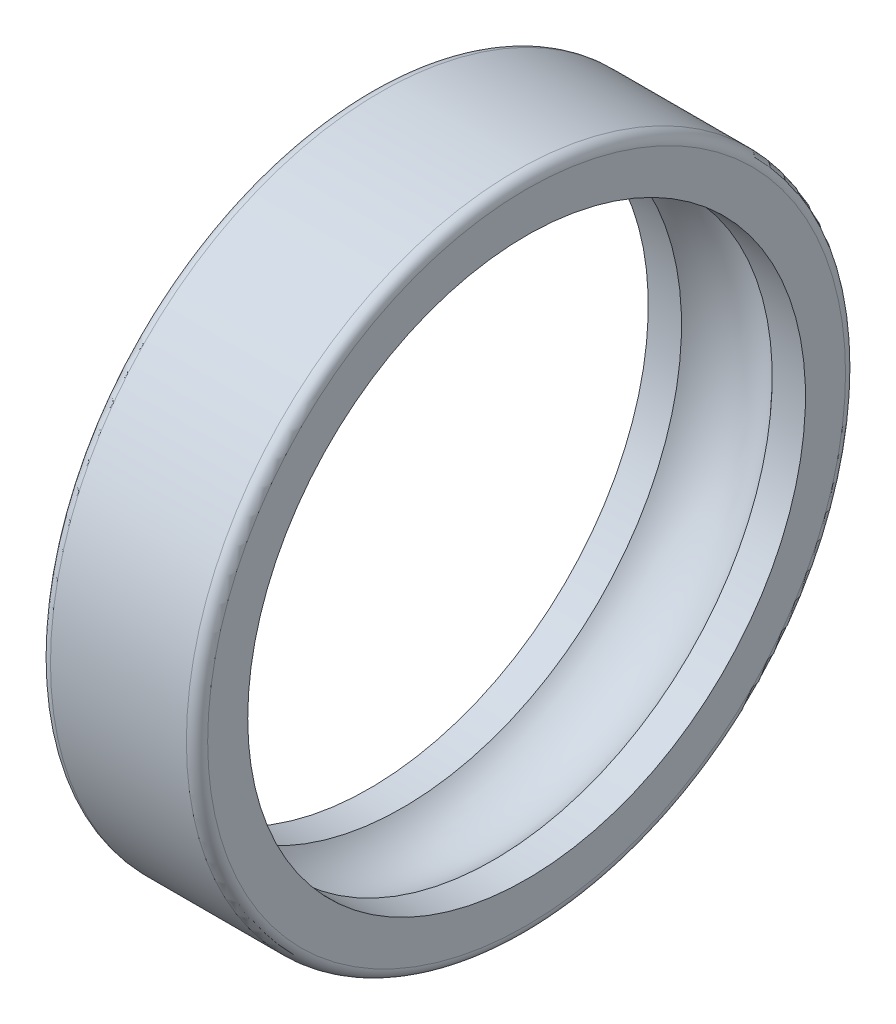
ISO-10303-21;
HEADER;
FILE_DESCRIPTION(('STEP AP214'),'2;1');
FILE_NAME('part.step','',(''),(''),'','','');
FILE_SCHEMA(('AUTOMOTIVE_DESIGN { 1 0 10303 214 1 1 1 1 }'));
ENDSEC;
DATA;
#1=APPLICATION_CONTEXT('core data for automotive mechanical design processes');
#2=APPLICATION_PROTOCOL_DEFINITION('international standard','automotive_design',2000,#1);
#3=PRODUCT_CONTEXT('',#1,'mechanical');
#4=PRODUCT('Part','Part','',(#3));
#5=PRODUCT_RELATED_PRODUCT_CATEGORY('part','',(#4));
#6=PRODUCT_DEFINITION_FORMATION('','',#4);
#7=PRODUCT_DEFINITION_CONTEXT('part definition',#1,'design');
#8=PRODUCT_DEFINITION('design','',#6,#7);
#9=PRODUCT_DEFINITION_SHAPE('','',#8);
#10=(LENGTH_UNIT() NAMED_UNIT(*) SI_UNIT(.MILLI.,.METRE.));
#11=(NAMED_UNIT(*) PLANE_ANGLE_UNIT() SI_UNIT($,.RADIAN.));
#12=(NAMED_UNIT(*) SI_UNIT($,.STERADIAN.) SOLID_ANGLE_UNIT());
#13=UNCERTAINTY_MEASURE_WITH_UNIT(LENGTH_MEASURE(1.E-05),#10,'distance_accuracy_value','');
#14=(GEOMETRIC_REPRESENTATION_CONTEXT(3) GLOBAL_UNCERTAINTY_ASSIGNED_CONTEXT((#13)) GLOBAL_UNIT_ASSIGNED_CONTEXT((#10,
#11,#12)) REPRESENTATION_CONTEXT('',''));
#15=CARTESIAN_POINT('',(0.,0.,0.));
#16=DIRECTION('',(0.,0.,1.));
#17=DIRECTION('',(1.,0.,0.));
#18=AXIS2_PLACEMENT_3D('',#15,#16,#17);
#19=CARTESIAN_POINT('',(-15.5,65.,0.));
#20=DIRECTION('',(1.,0.,0.));
#21=DIRECTION('',(0.,0.,-1.));
#22=AXIS2_PLACEMENT_3D('',#19,#20,#21);
#23=PLANE('',#22);
#24=CARTESIAN_POINT('',(-15.5,0.,0.));
#25=DIRECTION('',(1.,0.,0.));
#26=DIRECTION('',(0.,0.,-1.));
#27=AXIS2_PLACEMENT_3D('',#24,#25,#26);
#28=CIRCLE('',#27,62.9);
#29=CARTESIAN_POINT('',(-15.5,0.,-62.9));
#30=VERTEX_POINT('',#29);
#31=EDGE_CURVE('E10',#30,#30,#28,.F.);
#32=ORIENTED_EDGE('',*,*,#31,.T.);
#33=EDGE_LOOP('',(#32));
#34=FACE_BOUND('',#33,.T.);
#35=CARTESIAN_POINT('',(-15.5,0.,0.));
#36=DIRECTION('',(-1.,0.,0.));
#37=DIRECTION('',(0.,0.,1.));
#38=AXIS2_PLACEMENT_3D('',#35,#36,#37);
#39=CIRCLE('',#38,55.);
#40=CARTESIAN_POINT('',(-15.5,0.,55.));
#41=VERTEX_POINT('',#40);
#42=EDGE_CURVE('E54',#41,#41,#39,.T.);
#43=ORIENTED_EDGE('',*,*,#42,.F.);
#44=EDGE_LOOP('',(#43));
#45=FACE_BOUND('',#44,.T.);
#46=ADVANCED_FACE('F34',(#34,#45),#23,.F.);
#47=CARTESIAN_POINT('',(0.,0.,0.));
#48=DIRECTION('',(-1.,0.,0.));
#49=DIRECTION('',(0.,0.,1.));
#50=AXIS2_PLACEMENT_3D('',#47,#48,#49);
#51=CYLINDRICAL_SURFACE('',#50,55.);
#52=CARTESIAN_POINT('',(-8.94427190999916,0.,0.));
#53=DIRECTION('',(-1.,0.,0.));
#54=DIRECTION('',(0.,0.,1.));
#55=AXIS2_PLACEMENT_3D('',#52,#53,#54);
#56=CIRCLE('',#55,55.);
#57=CARTESIAN_POINT('',(-8.94427190999916,0.,55.));
#58=VERTEX_POINT('',#57);
#59=EDGE_CURVE('E57',#58,#58,#56,.T.);
#60=ORIENTED_EDGE('',*,*,#59,.F.);
#61=EDGE_LOOP('',(#60));
#62=FACE_BOUND('',#61,.T.);
#63=ORIENTED_EDGE('',*,*,#42,.T.);
#64=EDGE_LOOP('',(#63));
#65=FACE_BOUND('',#64,.T.);
#66=ADVANCED_FACE('F78',(#62,#65),#51,.F.);
#67=CARTESIAN_POINT('',(0.,0.,0.));
#68=DIRECTION('',(-1.,0.,0.));
#69=DIRECTION('',(0.,0.,1.));
#70=AXIS2_PLACEMENT_3D('',#67,#68,#69);
#71=TOROIDAL_SURFACE('',#70,47.,12.);
#72=CARTESIAN_POINT('',(8.94427190999916,0.,0.));
#73=DIRECTION('',(-1.,0.,0.));
#74=DIRECTION('',(0.,0.,1.));
#75=AXIS2_PLACEMENT_3D('',#72,#73,#74);
#76=CIRCLE('',#75,55.);
#77=CARTESIAN_POINT('',(8.94427190999916,0.,55.));
#78=VERTEX_POINT('',#77);
#79=EDGE_CURVE('E60',#78,#78,#76,.T.);
#80=ORIENTED_EDGE('',*,*,#79,.F.);
#81=EDGE_LOOP('',(#80));
#82=FACE_BOUND('',#81,.T.);
#83=ORIENTED_EDGE('',*,*,#59,.T.);
#84=EDGE_LOOP('',(#83));
#85=FACE_BOUND('',#84,.T.);
#86=ADVANCED_FACE('F72',(#82,#85),#71,.F.);
#87=CARTESIAN_POINT('',(0.,0.,0.));
#88=DIRECTION('',(-1.,0.,0.));
#89=DIRECTION('',(0.,0.,1.));
#90=AXIS2_PLACEMENT_3D('',#87,#88,#89);
#91=CYLINDRICAL_SURFACE('',#90,55.);
#92=CARTESIAN_POINT('',(15.5,0.,0.));
#93=DIRECTION('',(-1.,0.,0.));
#94=DIRECTION('',(0.,0.,1.));
#95=AXIS2_PLACEMENT_3D('',#92,#93,#94);
#96=CIRCLE('',#95,55.);
#97=CARTESIAN_POINT('',(15.5,0.,55.));
#98=VERTEX_POINT('',#97);
#99=EDGE_CURVE('E63',#98,#98,#96,.T.);
#100=ORIENTED_EDGE('',*,*,#99,.F.);
#101=EDGE_LOOP('',(#100));
#102=FACE_BOUND('',#101,.T.);
#103=ORIENTED_EDGE('',*,*,#79,.T.);
#104=EDGE_LOOP('',(#103));
#105=FACE_BOUND('',#104,.T.);
#106=ADVANCED_FACE('F69',(#102,#105),#91,.F.);
#107=CARTESIAN_POINT('',(15.5,65.,0.));
#108=DIRECTION('',(-1.,0.,0.));
#109=DIRECTION('',(0.,0.,1.));
#110=AXIS2_PLACEMENT_3D('',#107,#108,#109);
#111=PLANE('',#110);
#112=CARTESIAN_POINT('',(15.5,0.,0.));
#113=DIRECTION('',(-1.,0.,0.));
#114=DIRECTION('',(0.,0.,1.));
#115=AXIS2_PLACEMENT_3D('',#112,#113,#114);
#116=CIRCLE('',#115,62.9);
#117=CARTESIAN_POINT('',(15.5,0.,62.9));
#118=VERTEX_POINT('',#117);
#119=EDGE_CURVE('E41',#118,#118,#116,.F.);
#120=ORIENTED_EDGE('',*,*,#119,.T.);
#121=EDGE_LOOP('',(#120));
#122=FACE_BOUND('',#121,.T.);
#123=ORIENTED_EDGE('',*,*,#99,.T.);
#124=EDGE_LOOP('',(#123));
#125=FACE_BOUND('',#124,.T.);
#126=ADVANCED_FACE('F67',(#122,#125),#111,.F.);
#127=CARTESIAN_POINT('',(0.,0.,0.));
#128=DIRECTION('',(-1.,0.,0.));
#129=DIRECTION('',(0.,0.,1.));
#130=AXIS2_PLACEMENT_3D('',#127,#128,#129);
#131=CYLINDRICAL_SURFACE('',#130,65.);
#132=CARTESIAN_POINT('',(13.4,0.,0.));
#133=DIRECTION('',(-1.,0.,0.));
#134=DIRECTION('',(0.,0.,1.));
#135=AXIS2_PLACEMENT_3D('',#132,#133,#134);
#136=CIRCLE('',#135,65.);
#137=CARTESIAN_POINT('',(13.4,0.,65.));
#138=VERTEX_POINT('',#137);
#139=EDGE_CURVE('E45',#138,#138,#136,.T.);
#140=ORIENTED_EDGE('',*,*,#139,.T.);
#141=EDGE_LOOP('',(#140));
#142=FACE_BOUND('',#141,.T.);
#143=CARTESIAN_POINT('',(-13.4,0.,0.));
#144=DIRECTION('',(1.,0.,0.));
#145=DIRECTION('',(0.,0.,-1.));
#146=AXIS2_PLACEMENT_3D('',#143,#144,#145);
#147=CIRCLE('',#146,65.);
#148=CARTESIAN_POINT('',(-13.4,0.,-65.));
#149=VERTEX_POINT('',#148);
#150=EDGE_CURVE('E49',#149,#149,#147,.T.);
#151=ORIENTED_EDGE('',*,*,#150,.T.);
#152=EDGE_LOOP('',(#151));
#153=FACE_BOUND('',#152,.T.);
#154=ADVANCED_FACE('F93',(#142,#153),#131,.T.);
#155=CARTESIAN_POINT('',(13.4,0.,0.));
#156=DIRECTION('',(-1.,0.,0.));
#157=DIRECTION('',(0.,0.,1.));
#158=AXIS2_PLACEMENT_3D('',#155,#156,#157);
#159=TOROIDAL_SURFACE('',#158,62.9,2.1);
#160=ORIENTED_EDGE('',*,*,#119,.F.);
#161=EDGE_LOOP('',(#160));
#162=FACE_BOUND('',#161,.T.);
#163=ORIENTED_EDGE('',*,*,#139,.F.);
#164=EDGE_LOOP('',(#163));
#165=FACE_BOUND('',#164,.T.);
#166=ADVANCED_FACE('F91',(#162,#165),#159,.T.);
#167=CARTESIAN_POINT('',(-13.4,0.,0.));
#168=DIRECTION('',(1.,0.,0.));
#169=DIRECTION('',(0.,0.,-1.));
#170=AXIS2_PLACEMENT_3D('',#167,#168,#169);
#171=TOROIDAL_SURFACE('',#170,62.9,2.1);
#172=ORIENTED_EDGE('',*,*,#150,.F.);
#173=EDGE_LOOP('',(#172));
#174=FACE_BOUND('',#173,.T.);
#175=ORIENTED_EDGE('',*,*,#31,.F.);
#176=EDGE_LOOP('',(#175));
#177=FACE_BOUND('',#176,.T.);
#178=ADVANCED_FACE('F36',(#174,#177),#171,.T.);
#179=CLOSED_SHELL('',(#46,#66,#86,#106,#126,#154,#166,#178));
#180=MANIFOLD_SOLID_BREP('B2',#179);
#181=ADVANCED_BREP_SHAPE_REPRESENTATION('',(#18,#180),#14);
#182=SHAPE_DEFINITION_REPRESENTATION(#9,#181);
ENDSEC;
END-ISO-10303-21;
